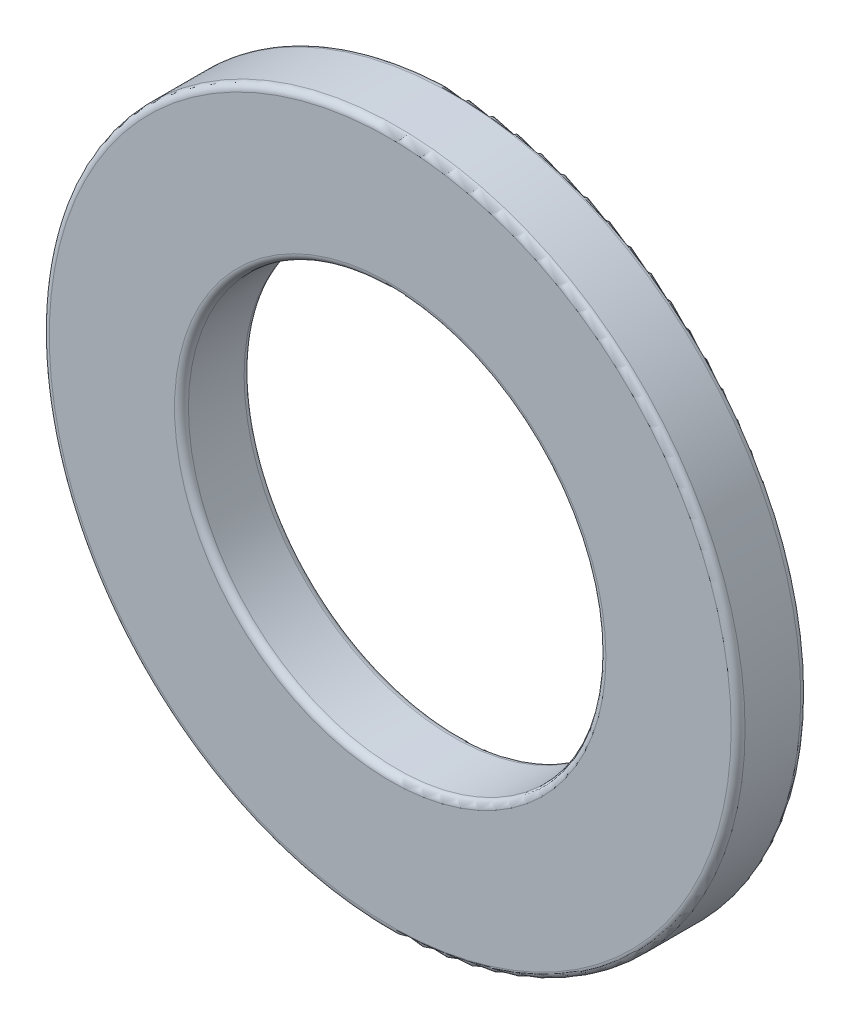
ISO-10303-21;
HEADER;
FILE_DESCRIPTION(('STEP AP214'),'2;1');
FILE_NAME('part.step','',(''),(''),'','','');
FILE_SCHEMA(('AUTOMOTIVE_DESIGN { 1 0 10303 214 1 1 1 1 }'));
ENDSEC;
DATA;
#1=APPLICATION_CONTEXT('core data for automotive mechanical design processes');
#2=APPLICATION_PROTOCOL_DEFINITION('international standard','automotive_design',2000,#1);
#3=PRODUCT_CONTEXT('',#1,'mechanical');
#4=PRODUCT('Part','Part','',(#3));
#5=PRODUCT_RELATED_PRODUCT_CATEGORY('part','',(#4));
#6=PRODUCT_DEFINITION_FORMATION('','',#4);
#7=PRODUCT_DEFINITION_CONTEXT('part definition',#1,'design');
#8=PRODUCT_DEFINITION('design','',#6,#7);
#9=PRODUCT_DEFINITION_SHAPE('','',#8);
#10=(LENGTH_UNIT() NAMED_UNIT(*) SI_UNIT(.MILLI.,.METRE.));
#11=(NAMED_UNIT(*) PLANE_ANGLE_UNIT() SI_UNIT($,.RADIAN.));
#12=(NAMED_UNIT(*) SI_UNIT($,.STERADIAN.) SOLID_ANGLE_UNIT());
#13=UNCERTAINTY_MEASURE_WITH_UNIT(LENGTH_MEASURE(1.E-05),#10,'distance_accuracy_value','');
#14=(GEOMETRIC_REPRESENTATION_CONTEXT(3) GLOBAL_UNCERTAINTY_ASSIGNED_CONTEXT((#13)) GLOBAL_UNIT_ASSIGNED_CONTEXT((#10,
#11,#12)) REPRESENTATION_CONTEXT('',''));
#15=CARTESIAN_POINT('',(0.,0.,0.));
#16=DIRECTION('',(0.,0.,1.));
#17=DIRECTION('',(1.,0.,0.));
#18=AXIS2_PLACEMENT_3D('',#15,#16,#17);
#19=CARTESIAN_POINT('',(0.,0.,1.5875));
#20=DIRECTION('',(0.,0.,1.));
#21=DIRECTION('',(1.,0.,0.));
#22=AXIS2_PLACEMENT_3D('',#19,#20,#21);
#23=PLANE('',#22);
#24=CARTESIAN_POINT('',(0.,0.,1.5875));
#25=DIRECTION('',(0.,0.,1.));
#26=DIRECTION('',(1.,0.,0.));
#27=AXIS2_PLACEMENT_3D('',#24,#25,#26);
#28=CIRCLE('',#27,9.8425);
#29=CARTESIAN_POINT('',(9.8425,0.,1.5875));
#30=VERTEX_POINT('',#29);
#31=EDGE_CURVE('E10',#30,#30,#28,.F.);
#32=ORIENTED_EDGE('',*,*,#31,.T.);
#33=EDGE_LOOP('',(#32));
#34=FACE_BOUND('',#33,.T.);
#35=CARTESIAN_POINT('',(0.,0.,1.5875));
#36=DIRECTION('',(0.,0.,1.));
#37=DIRECTION('',(1.,0.,0.));
#38=AXIS2_PLACEMENT_3D('',#35,#36,#37);
#39=CIRCLE('',#38,15.5575);
#40=CARTESIAN_POINT('',(15.5575,0.,1.5875));
#41=VERTEX_POINT('',#40);
#42=EDGE_CURVE('E42',#41,#41,#39,.T.);
#43=ORIENTED_EDGE('',*,*,#42,.T.);
#44=EDGE_LOOP('',(#43));
#45=FACE_BOUND('',#44,.T.);
#46=ADVANCED_FACE('F35',(#34,#45),#23,.T.);
#47=CARTESIAN_POINT('',(0.,0.,1.5875));
#48=DIRECTION('',(0.,0.,-1.));
#49=DIRECTION('',(-1.,0.,0.));
#50=AXIS2_PLACEMENT_3D('',#47,#48,#49);
#51=CYLINDRICAL_SURFACE('',#50,15.875);
#52=CARTESIAN_POINT('',(0.,0.,-1.27));
#53=DIRECTION('',(0.,0.,1.));
#54=DIRECTION('',(1.,0.,0.));
#55=AXIS2_PLACEMENT_3D('',#52,#53,#54);
#56=CIRCLE('',#55,15.875);
#57=CARTESIAN_POINT('',(15.875,0.,-1.27));
#58=VERTEX_POINT('',#57);
#59=EDGE_CURVE('E61',#58,#58,#56,.T.);
#60=ORIENTED_EDGE('',*,*,#59,.T.);
#61=EDGE_LOOP('',(#60));
#62=FACE_BOUND('',#61,.T.);
#63=CARTESIAN_POINT('',(0.,0.,1.27));
#64=DIRECTION('',(0.,0.,1.));
#65=DIRECTION('',(1.,0.,0.));
#66=AXIS2_PLACEMENT_3D('',#63,#64,#65);
#67=CIRCLE('',#66,15.875);
#68=CARTESIAN_POINT('',(15.875,0.,1.27));
#69=VERTEX_POINT('',#68);
#70=EDGE_CURVE('E64',#69,#69,#67,.F.);
#71=ORIENTED_EDGE('',*,*,#70,.T.);
#72=EDGE_LOOP('',(#71));
#73=FACE_BOUND('',#72,.T.);
#74=ADVANCED_FACE('F68',(#62,#73),#51,.T.);
#75=CARTESIAN_POINT('',(0.,0.,1.5875));
#76=DIRECTION('',(0.,0.,-1.));
#77=DIRECTION('',(-1.,0.,0.));
#78=AXIS2_PLACEMENT_3D('',#75,#76,#77);
#79=CYLINDRICAL_SURFACE('',#78,9.525);
#80=CARTESIAN_POINT('',(0.,0.,-1.27));
#81=DIRECTION('',(0.,0.,1.));
#82=DIRECTION('',(1.,0.,0.));
#83=AXIS2_PLACEMENT_3D('',#80,#81,#82);
#84=CIRCLE('',#83,9.525);
#85=CARTESIAN_POINT('',(9.525,0.,-1.27));
#86=VERTEX_POINT('',#85);
#87=EDGE_CURVE('E46',#86,#86,#84,.F.);
#88=ORIENTED_EDGE('',*,*,#87,.T.);
#89=EDGE_LOOP('',(#88));
#90=FACE_BOUND('',#89,.T.);
#91=CARTESIAN_POINT('',(0.,0.,1.27));
#92=DIRECTION('',(0.,0.,1.));
#93=DIRECTION('',(1.,0.,0.));
#94=AXIS2_PLACEMENT_3D('',#91,#92,#93);
#95=CIRCLE('',#94,9.525);
#96=CARTESIAN_POINT('',(9.525,0.,1.27));
#97=VERTEX_POINT('',#96);
#98=EDGE_CURVE('E50',#97,#97,#95,.T.);
#99=ORIENTED_EDGE('',*,*,#98,.T.);
#100=EDGE_LOOP('',(#99));
#101=FACE_BOUND('',#100,.T.);
#102=ADVANCED_FACE('F83',(#90,#101),#79,.F.);
#103=CARTESIAN_POINT('',(0.,0.,-1.5875));
#104=DIRECTION('',(0.,0.,1.));
#105=DIRECTION('',(1.,0.,0.));
#106=AXIS2_PLACEMENT_3D('',#103,#104,#105);
#107=PLANE('',#106);
#108=CARTESIAN_POINT('',(0.,0.,-1.5875));
#109=DIRECTION('',(0.,0.,1.));
#110=DIRECTION('',(1.,0.,0.));
#111=AXIS2_PLACEMENT_3D('',#108,#109,#110);
#112=CIRCLE('',#111,15.5575);
#113=CARTESIAN_POINT('',(15.5575,0.,-1.5875));
#114=VERTEX_POINT('',#113);
#115=EDGE_CURVE('E55',#114,#114,#112,.F.);
#116=ORIENTED_EDGE('',*,*,#115,.T.);
#117=EDGE_LOOP('',(#116));
#118=FACE_BOUND('',#117,.T.);
#119=CARTESIAN_POINT('',(0.,0.,-1.5875));
#120=DIRECTION('',(0.,0.,1.));
#121=DIRECTION('',(1.,0.,0.));
#122=AXIS2_PLACEMENT_3D('',#119,#120,#121);
#123=CIRCLE('',#122,9.8425);
#124=CARTESIAN_POINT('',(9.8425,0.,-1.5875));
#125=VERTEX_POINT('',#124);
#126=EDGE_CURVE('E58',#125,#125,#123,.T.);
#127=ORIENTED_EDGE('',*,*,#126,.T.);
#128=EDGE_LOOP('',(#127));
#129=FACE_BOUND('',#128,.T.);
#130=ADVANCED_FACE('F92',(#118,#129),#107,.F.);
#131=CARTESIAN_POINT('',(0.,0.,-1.27));
#132=DIRECTION('',(0.,0.,1.));
#133=DIRECTION('',(1.,0.,0.));
#134=AXIS2_PLACEMENT_3D('',#131,#132,#133);
#135=TOROIDAL_SURFACE('',#134,15.5575,0.3175);
#136=ORIENTED_EDGE('',*,*,#115,.F.);
#137=EDGE_LOOP('',(#136));
#138=FACE_BOUND('',#137,.T.);
#139=ORIENTED_EDGE('',*,*,#59,.F.);
#140=EDGE_LOOP('',(#139));
#141=FACE_BOUND('',#140,.T.);
#142=ADVANCED_FACE('F89',(#138,#141),#135,.T.);
#143=CARTESIAN_POINT('',(0.,0.,-1.27));
#144=DIRECTION('',(0.,0.,1.));
#145=DIRECTION('',(1.,0.,0.));
#146=AXIS2_PLACEMENT_3D('',#143,#144,#145);
#147=TOROIDAL_SURFACE('',#146,9.8425,0.3175);
#148=ORIENTED_EDGE('',*,*,#87,.F.);
#149=EDGE_LOOP('',(#148));
#150=FACE_BOUND('',#149,.T.);
#151=ORIENTED_EDGE('',*,*,#126,.F.);
#152=EDGE_LOOP('',(#151));
#153=FACE_BOUND('',#152,.T.);
#154=ADVANCED_FACE('F76',(#150,#153),#147,.T.);
#155=CARTESIAN_POINT('',(0.,0.,1.27));
#156=DIRECTION('',(0.,0.,1.));
#157=DIRECTION('',(1.,0.,0.));
#158=AXIS2_PLACEMENT_3D('',#155,#156,#157);
#159=TOROIDAL_SURFACE('',#158,9.8425,0.3175);
#160=ORIENTED_EDGE('',*,*,#31,.F.);
#161=EDGE_LOOP('',(#160));
#162=FACE_BOUND('',#161,.T.);
#163=ORIENTED_EDGE('',*,*,#98,.F.);
#164=EDGE_LOOP('',(#163));
#165=FACE_BOUND('',#164,.T.);
#166=ADVANCED_FACE('F72',(#162,#165),#159,.T.);
#167=CARTESIAN_POINT('',(0.,0.,1.27));
#168=DIRECTION('',(0.,0.,1.));
#169=DIRECTION('',(1.,0.,0.));
#170=AXIS2_PLACEMENT_3D('',#167,#168,#169);
#171=TOROIDAL_SURFACE('',#170,15.5575,0.3175);
#172=ORIENTED_EDGE('',*,*,#70,.F.);
#173=EDGE_LOOP('',(#172));
#174=FACE_BOUND('',#173,.T.);
#175=ORIENTED_EDGE('',*,*,#42,.F.);
#176=EDGE_LOOP('',(#175));
#177=FACE_BOUND('',#176,.T.);
#178=ADVANCED_FACE('F37',(#174,#177),#171,.T.);
#179=CLOSED_SHELL('',(#46,#74,#102,#130,#142,#154,#166,#178));
#180=MANIFOLD_SOLID_BREP('B2',#179);
#181=ADVANCED_BREP_SHAPE_REPRESENTATION('',(#18,#180),#14);
#182=SHAPE_DEFINITION_REPRESENTATION(#9,#181);
ENDSEC;
END-ISO-10303-21;
